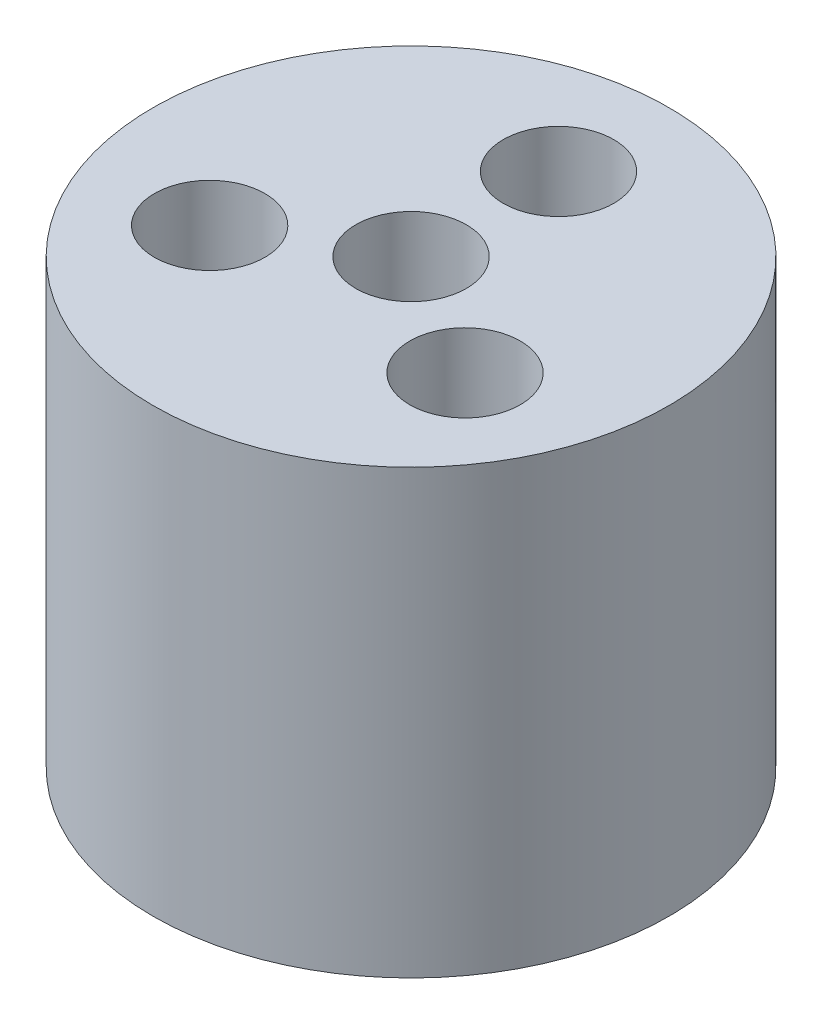
ISO-10303-21;
HEADER;
FILE_DESCRIPTION(('STEP AP214'),'2;1');
FILE_NAME('part.step','',(''),(''),'','','');
FILE_SCHEMA(('AUTOMOTIVE_DESIGN { 1 0 10303 214 1 1 1 1 }'));
ENDSEC;
DATA;
#1=APPLICATION_CONTEXT('core data for automotive mechanical design processes');
#2=APPLICATION_PROTOCOL_DEFINITION('international standard','automotive_design',2000,#1);
#3=PRODUCT_CONTEXT('',#1,'mechanical');
#4=PRODUCT('Part','Part','',(#3));
#5=PRODUCT_RELATED_PRODUCT_CATEGORY('part','',(#4));
#6=PRODUCT_DEFINITION_FORMATION('','',#4);
#7=PRODUCT_DEFINITION_CONTEXT('part definition',#1,'design');
#8=PRODUCT_DEFINITION('design','',#6,#7);
#9=PRODUCT_DEFINITION_SHAPE('','',#8);
#10=(LENGTH_UNIT() NAMED_UNIT(*) SI_UNIT(.MILLI.,.METRE.));
#11=(NAMED_UNIT(*) PLANE_ANGLE_UNIT() SI_UNIT($,.RADIAN.));
#12=(NAMED_UNIT(*) SI_UNIT($,.STERADIAN.) SOLID_ANGLE_UNIT());
#13=UNCERTAINTY_MEASURE_WITH_UNIT(LENGTH_MEASURE(1.E-05),#10,'distance_accuracy_value','');
#14=(GEOMETRIC_REPRESENTATION_CONTEXT(3) GLOBAL_UNCERTAINTY_ASSIGNED_CONTEXT((#13)) GLOBAL_UNIT_ASSIGNED_CONTEXT((#10,
#11,#12)) REPRESENTATION_CONTEXT('',''));
#15=CARTESIAN_POINT('',(0.,0.,0.));
#16=DIRECTION('',(0.,0.,1.));
#17=DIRECTION('',(1.,0.,0.));
#18=AXIS2_PLACEMENT_3D('',#15,#16,#17);
#19=CARTESIAN_POINT('',(0.,12.,0.));
#20=DIRECTION('',(0.,-1.,0.));
#21=DIRECTION('',(0.,0.,-1.));
#22=AXIS2_PLACEMENT_3D('',#19,#20,#21);
#23=CYLINDRICAL_SURFACE('',#22,14.);
#24=CARTESIAN_POINT('',(0.,12.,0.));
#25=DIRECTION('',(0.,1.,0.));
#26=DIRECTION('',(0.,0.,1.));
#27=AXIS2_PLACEMENT_3D('',#24,#25,#26);
#28=CIRCLE('',#27,14.);
#29=CARTESIAN_POINT('',(0.,12.,14.));
#30=VERTEX_POINT('',#29);
#31=EDGE_CURVE('E10',#30,#30,#28,.T.);
#32=ORIENTED_EDGE('',*,*,#31,.F.);
#33=EDGE_LOOP('',(#32));
#34=FACE_BOUND('',#33,.T.);
#35=CARTESIAN_POINT('',(0.,-12.,0.));
#36=DIRECTION('',(0.,1.,0.));
#37=DIRECTION('',(0.,0.,1.));
#38=AXIS2_PLACEMENT_3D('',#35,#36,#37);
#39=CIRCLE('',#38,14.);
#40=CARTESIAN_POINT('',(0.,-12.,14.));
#41=VERTEX_POINT('',#40);
#42=EDGE_CURVE('E33',#41,#41,#39,.T.);
#43=ORIENTED_EDGE('',*,*,#42,.T.);
#44=EDGE_LOOP('',(#43));
#45=FACE_BOUND('',#44,.T.);
#46=ADVANCED_FACE('F30',(#34,#45),#23,.T.);
#47=CARTESIAN_POINT('',(0.,12.,0.));
#48=DIRECTION('',(0.,1.,0.));
#49=DIRECTION('',(0.,0.,1.));
#50=AXIS2_PLACEMENT_3D('',#47,#48,#49);
#51=PLANE('',#50);
#52=CARTESIAN_POINT('',(6.92820323027555,12.,3.99999999999994));
#53=DIRECTION('',(0.,1.,0.));
#54=DIRECTION('',(0.,0.,1.));
#55=AXIS2_PLACEMENT_3D('',#52,#53,#54);
#56=CIRCLE('',#55,2.99999999999999);
#57=CARTESIAN_POINT('',(6.92820323027555,12.,6.99999999999992));
#58=VERTEX_POINT('',#57);
#59=EDGE_CURVE('E62',#58,#58,#56,.T.);
#60=ORIENTED_EDGE('',*,*,#59,.F.);
#61=EDGE_LOOP('',(#60));
#62=FACE_BOUND('',#61,.T.);
#63=CARTESIAN_POINT('',(-6.92820323027549,12.,4.00000000000003));
#64=DIRECTION('',(0.,1.,0.));
#65=DIRECTION('',(0.,0.,1.));
#66=AXIS2_PLACEMENT_3D('',#63,#64,#65);
#67=CIRCLE('',#66,2.99999999999999);
#68=CARTESIAN_POINT('',(-6.92820323027549,12.,7.00000000000002));
#69=VERTEX_POINT('',#68);
#70=EDGE_CURVE('E56',#69,#69,#67,.T.);
#71=ORIENTED_EDGE('',*,*,#70,.F.);
#72=EDGE_LOOP('',(#71));
#73=FACE_BOUND('',#72,.T.);
#74=CARTESIAN_POINT('',(0.,12.,-8.));
#75=DIRECTION('',(0.,1.,0.));
#76=DIRECTION('',(0.,0.,1.));
#77=AXIS2_PLACEMENT_3D('',#74,#75,#76);
#78=CIRCLE('',#77,2.99999999999999);
#79=CARTESIAN_POINT('',(0.,12.,-5.00000000000001));
#80=VERTEX_POINT('',#79);
#81=EDGE_CURVE('E50',#80,#80,#78,.T.);
#82=ORIENTED_EDGE('',*,*,#81,.F.);
#83=EDGE_LOOP('',(#82));
#84=FACE_BOUND('',#83,.T.);
#85=CARTESIAN_POINT('',(0.,12.,0.));
#86=DIRECTION('',(0.,1.,0.));
#87=DIRECTION('',(0.,0.,1.));
#88=AXIS2_PLACEMENT_3D('',#85,#86,#87);
#89=CIRCLE('',#88,3.);
#90=CARTESIAN_POINT('',(0.,12.,3.));
#91=VERTEX_POINT('',#90);
#92=EDGE_CURVE('E44',#91,#91,#89,.T.);
#93=ORIENTED_EDGE('',*,*,#92,.F.);
#94=EDGE_LOOP('',(#93));
#95=FACE_BOUND('',#94,.T.);
#96=ORIENTED_EDGE('',*,*,#31,.T.);
#97=EDGE_LOOP('',(#96));
#98=FACE_BOUND('',#97,.T.);
#99=ADVANCED_FACE('F68',(#62,#73,#84,#95,#98),#51,.T.);
#100=CARTESIAN_POINT('',(0.,-12.,0.));
#101=DIRECTION('',(0.,1.,0.));
#102=DIRECTION('',(0.,0.,1.));
#103=AXIS2_PLACEMENT_3D('',#100,#101,#102);
#104=PLANE('',#103);
#105=CARTESIAN_POINT('',(6.92820323027555,-12.,3.99999999999994));
#106=DIRECTION('',(0.,1.,0.));
#107=DIRECTION('',(0.,0.,1.));
#108=AXIS2_PLACEMENT_3D('',#105,#106,#107);
#109=CIRCLE('',#108,3.);
#110=CARTESIAN_POINT('',(6.92820323027555,-12.,6.99999999999993));
#111=VERTEX_POINT('',#110);
#112=EDGE_CURVE('E59',#111,#111,#109,.T.);
#113=ORIENTED_EDGE('',*,*,#112,.T.);
#114=EDGE_LOOP('',(#113));
#115=FACE_BOUND('',#114,.T.);
#116=CARTESIAN_POINT('',(-6.92820323027549,-12.,4.00000000000003));
#117=DIRECTION('',(0.,1.,0.));
#118=DIRECTION('',(0.,0.,1.));
#119=AXIS2_PLACEMENT_3D('',#116,#117,#118);
#120=CIRCLE('',#119,3.);
#121=CARTESIAN_POINT('',(-6.92820323027549,-12.,7.00000000000003));
#122=VERTEX_POINT('',#121);
#123=EDGE_CURVE('E53',#122,#122,#120,.T.);
#124=ORIENTED_EDGE('',*,*,#123,.T.);
#125=EDGE_LOOP('',(#124));
#126=FACE_BOUND('',#125,.T.);
#127=CARTESIAN_POINT('',(0.,-12.,-8.));
#128=DIRECTION('',(0.,1.,0.));
#129=DIRECTION('',(0.,0.,1.));
#130=AXIS2_PLACEMENT_3D('',#127,#128,#129);
#131=CIRCLE('',#130,3.);
#132=CARTESIAN_POINT('',(0.,-12.,-5.));
#133=VERTEX_POINT('',#132);
#134=EDGE_CURVE('E47',#133,#133,#131,.T.);
#135=ORIENTED_EDGE('',*,*,#134,.T.);
#136=EDGE_LOOP('',(#135));
#137=FACE_BOUND('',#136,.T.);
#138=CARTESIAN_POINT('',(0.,-12.,0.));
#139=DIRECTION('',(0.,1.,0.));
#140=DIRECTION('',(0.,0.,1.));
#141=AXIS2_PLACEMENT_3D('',#138,#139,#140);
#142=CIRCLE('',#141,3.);
#143=CARTESIAN_POINT('',(0.,-12.,3.));
#144=VERTEX_POINT('',#143);
#145=EDGE_CURVE('E40',#144,#144,#142,.T.);
#146=ORIENTED_EDGE('',*,*,#145,.T.);
#147=EDGE_LOOP('',(#146));
#148=FACE_BOUND('',#147,.T.);
#149=ORIENTED_EDGE('',*,*,#42,.F.);
#150=EDGE_LOOP('',(#149));
#151=FACE_BOUND('',#150,.T.);
#152=ADVANCED_FACE('F71',(#115,#126,#137,#148,#151),#104,.F.);
#153=CARTESIAN_POINT('',(0.,12.,0.));
#154=DIRECTION('',(0.,1.,0.));
#155=DIRECTION('',(0.,0.,1.));
#156=AXIS2_PLACEMENT_3D('',#153,#154,#155);
#157=CYLINDRICAL_SURFACE('',#156,3.);
#158=ORIENTED_EDGE('',*,*,#145,.F.);
#159=EDGE_LOOP('',(#158));
#160=FACE_BOUND('',#159,.T.);
#161=ORIENTED_EDGE('',*,*,#92,.T.);
#162=EDGE_LOOP('',(#161));
#163=FACE_BOUND('',#162,.T.);
#164=ADVANCED_FACE('F79',(#160,#163),#157,.F.);
#165=CARTESIAN_POINT('',(0.,12.,-8.));
#166=DIRECTION('',(0.,1.,0.));
#167=DIRECTION('',(0.,0.,1.));
#168=AXIS2_PLACEMENT_3D('',#165,#166,#167);
#169=CYLINDRICAL_SURFACE('',#168,2.99999999999999);
#170=ORIENTED_EDGE('',*,*,#134,.F.);
#171=EDGE_LOOP('',(#170));
#172=FACE_BOUND('',#171,.T.);
#173=ORIENTED_EDGE('',*,*,#81,.T.);
#174=EDGE_LOOP('',(#173));
#175=FACE_BOUND('',#174,.T.);
#176=ADVANCED_FACE('F81',(#172,#175),#169,.F.);
#177=CARTESIAN_POINT('',(-6.92820323027549,12.,4.00000000000003));
#178=DIRECTION('',(0.,1.,0.));
#179=DIRECTION('',(0.,0.,1.));
#180=AXIS2_PLACEMENT_3D('',#177,#178,#179);
#181=CYLINDRICAL_SURFACE('',#180,2.99999999999999);
#182=ORIENTED_EDGE('',*,*,#123,.F.);
#183=EDGE_LOOP('',(#182));
#184=FACE_BOUND('',#183,.T.);
#185=ORIENTED_EDGE('',*,*,#70,.T.);
#186=EDGE_LOOP('',(#185));
#187=FACE_BOUND('',#186,.T.);
#188=ADVANCED_FACE('F88',(#184,#187),#181,.F.);
#189=CARTESIAN_POINT('',(6.92820323027555,12.,3.99999999999994));
#190=DIRECTION('',(0.,1.,0.));
#191=DIRECTION('',(0.,0.,1.));
#192=AXIS2_PLACEMENT_3D('',#189,#190,#191);
#193=CYLINDRICAL_SURFACE('',#192,2.99999999999999);
#194=ORIENTED_EDGE('',*,*,#112,.F.);
#195=EDGE_LOOP('',(#194));
#196=FACE_BOUND('',#195,.T.);
#197=ORIENTED_EDGE('',*,*,#59,.T.);
#198=EDGE_LOOP('',(#197));
#199=FACE_BOUND('',#198,.T.);
#200=ADVANCED_FACE('F66',(#196,#199),#193,.F.);
#201=CLOSED_SHELL('',(#46,#99,#152,#164,#176,#188,#200));
#202=MANIFOLD_SOLID_BREP('B2',#201);
#203=ADVANCED_BREP_SHAPE_REPRESENTATION('',(#18,#202),#14);
#204=SHAPE_DEFINITION_REPRESENTATION(#9,#203);
ENDSEC;
END-ISO-10303-21;
